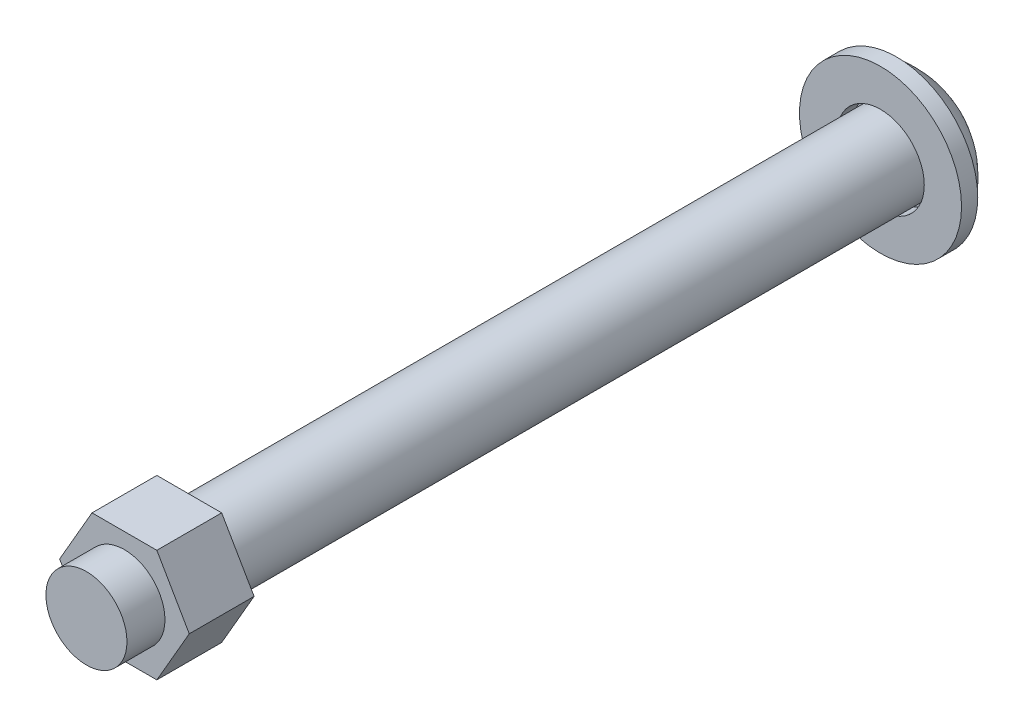
ISO-10303-21;
HEADER;
FILE_DESCRIPTION(('STEP AP214'),'2;1');
FILE_NAME('part.step','',(''),(''),'','','');
FILE_SCHEMA(('AUTOMOTIVE_DESIGN { 1 0 10303 214 1 1 1 1 }'));
ENDSEC;
DATA;
#1=APPLICATION_CONTEXT('core data for automotive mechanical design processes');
#2=APPLICATION_PROTOCOL_DEFINITION('international standard','automotive_design',2000,#1);
#3=PRODUCT_CONTEXT('',#1,'mechanical');
#4=PRODUCT('Part','Part','',(#3));
#5=PRODUCT_RELATED_PRODUCT_CATEGORY('part','',(#4));
#6=PRODUCT_DEFINITION_FORMATION('','',#4);
#7=PRODUCT_DEFINITION_CONTEXT('part definition',#1,'design');
#8=PRODUCT_DEFINITION('design','',#6,#7);
#9=PRODUCT_DEFINITION_SHAPE('','',#8);
#10=(LENGTH_UNIT() NAMED_UNIT(*) SI_UNIT(.MILLI.,.METRE.));
#11=(NAMED_UNIT(*) PLANE_ANGLE_UNIT() SI_UNIT($,.RADIAN.));
#12=(NAMED_UNIT(*) SI_UNIT($,.STERADIAN.) SOLID_ANGLE_UNIT());
#13=UNCERTAINTY_MEASURE_WITH_UNIT(LENGTH_MEASURE(1.E-05),#10,'distance_accuracy_value','');
#14=(GEOMETRIC_REPRESENTATION_CONTEXT(3) GLOBAL_UNCERTAINTY_ASSIGNED_CONTEXT((#13)) GLOBAL_UNIT_ASSIGNED_CONTEXT((#10,
#11,#12)) REPRESENTATION_CONTEXT('',''));
#15=CARTESIAN_POINT('',(0.,0.,0.));
#16=DIRECTION('',(0.,0.,1.));
#17=DIRECTION('',(1.,0.,0.));
#18=AXIS2_PLACEMENT_3D('',#15,#16,#17);
#19=CARTESIAN_POINT('',(-52.,50.6,76.75));
#20=DIRECTION('',(0.,0.,1.));
#21=DIRECTION('',(1.,0.,0.));
#22=AXIS2_PLACEMENT_3D('',#19,#20,#21);
#23=PLANE('',#22);
#24=CARTESIAN_POINT('',(-52.,50.6,76.75));
#25=DIRECTION('',(0.,0.,1.));
#26=DIRECTION('',(1.,0.,0.));
#27=AXIS2_PLACEMENT_3D('',#24,#25,#26);
#28=CIRCLE('',#27,2.5);
#29=CARTESIAN_POINT('',(-49.5,50.6,76.75));
#30=VERTEX_POINT('',#29);
#31=EDGE_CURVE('E9',#30,#30,#28,.T.);
#32=ORIENTED_EDGE('',*,*,#31,.T.);
#33=EDGE_LOOP('',(#32));
#34=FACE_BOUND('',#33,.T.);
#35=ADVANCED_FACE('F14',(#34),#23,.T.);
#36=CARTESIAN_POINT('',(-52.,50.6,26.75));
#37=DIRECTION('',(0.,0.,1.));
#38=DIRECTION('',(1.,0.,0.));
#39=AXIS2_PLACEMENT_3D('',#36,#37,#38);
#40=CYLINDRICAL_SURFACE('',#39,2.5);
#41=DIRECTION('',(0.,0.,1.));
#42=VECTOR('',#41,1.);
#43=CARTESIAN_POINT('',(-49.5,50.6,26.75));
#44=LINE('',#43,#42);
#45=CARTESIAN_POINT('',(-49.5,50.6,74.405110294118));
#46=VERTEX_POINT('',#45);
#47=EDGE_CURVE('E25',#46,#30,#44,.T.);
#48=ORIENTED_EDGE('',*,*,#47,.T.);
#49=ORIENTED_EDGE('',*,*,#31,.F.);
#50=ORIENTED_EDGE('',*,*,#47,.F.);
#51=CARTESIAN_POINT('',(-52.,50.6,74.405110294118));
#52=DIRECTION('',(0.,0.,1.));
#53=DIRECTION('',(1.,0.,0.));
#54=AXIS2_PLACEMENT_3D('',#51,#52,#53);
#55=CIRCLE('',#54,2.5);
#56=EDGE_CURVE('E138',#46,#46,#55,.T.);
#57=ORIENTED_EDGE('',*,*,#56,.T.);
#58=EDGE_LOOP('',(#48,#49,#50,#57));
#59=FACE_BOUND('',#58,.T.);
#60=ADVANCED_FACE('F269',(#59),#40,.T.);
#61=CARTESIAN_POINT('',(-52.,50.6,74.405110294118));
#62=DIRECTION('',(0.,0.,1.));
#63=DIRECTION('',(1.,0.,0.));
#64=AXIS2_PLACEMENT_3D('',#61,#62,#63);
#65=PLANE('',#64);
#66=ORIENTED_EDGE('',*,*,#56,.F.);
#67=EDGE_LOOP('',(#66));
#68=FACE_BOUND('',#67,.T.);
#69=DIRECTION('',(-0.50000000000019,0.866025403784329,0.));
#70=VECTOR('',#69,1.);
#71=CARTESIAN_POINT('',(-48.,50.6,74.405110294118));
#72=LINE('',#71,#70);
#73=CARTESIAN_POINT('',(-48.,50.6,74.405110294118));
#74=VERTEX_POINT('',#73);
#75=CARTESIAN_POINT('',(-50.,54.064101615138,74.405110294118));
#76=VERTEX_POINT('',#75);
#77=EDGE_CURVE('E205',#74,#76,#72,.T.);
#78=ORIENTED_EDGE('',*,*,#77,.T.);
#79=DIRECTION('',(-1.,0.,0.));
#80=VECTOR('',#79,1.);
#81=CARTESIAN_POINT('',(-50.,54.064101615138,74.405110294118));
#82=LINE('',#81,#80);
#83=CARTESIAN_POINT('',(-54.,54.064101615138,74.405110294118));
#84=VERTEX_POINT('',#83);
#85=EDGE_CURVE('E144',#76,#84,#82,.T.);
#86=ORIENTED_EDGE('',*,*,#85,.T.);
#87=DIRECTION('',(-0.50000000000019,-0.866025403784329,0.));
#88=VECTOR('',#87,1.);
#89=CARTESIAN_POINT('',(-54.,54.064101615138,74.405110294118));
#90=LINE('',#89,#88);
#91=CARTESIAN_POINT('',(-56.,50.6,74.405110294118));
#92=VERTEX_POINT('',#91);
#93=EDGE_CURVE('E139',#84,#92,#90,.T.);
#94=ORIENTED_EDGE('',*,*,#93,.T.);
#95=DIRECTION('',(0.50000000000019,-0.866025403784329,0.));
#96=VECTOR('',#95,1.);
#97=CARTESIAN_POINT('',(-56.,50.6,74.405110294118));
#98=LINE('',#97,#96);
#99=CARTESIAN_POINT('',(-54.,47.135898384862,74.405110294118));
#100=VERTEX_POINT('',#99);
#101=EDGE_CURVE('E127',#92,#100,#98,.T.);
#102=ORIENTED_EDGE('',*,*,#101,.T.);
#103=DIRECTION('',(1.,0.,0.));
#104=VECTOR('',#103,1.);
#105=CARTESIAN_POINT('',(-54.,47.135898384862,74.405110294118));
#106=LINE('',#105,#104);
#107=CARTESIAN_POINT('',(-50.,47.135898384862,74.405110294118));
#108=VERTEX_POINT('',#107);
#109=EDGE_CURVE('E157',#100,#108,#106,.T.);
#110=ORIENTED_EDGE('',*,*,#109,.T.);
#111=DIRECTION('',(0.50000000000019,0.866025403784329,0.));
#112=VECTOR('',#111,1.);
#113=CARTESIAN_POINT('',(-50.,47.135898384862,74.405110294118));
#114=LINE('',#113,#112);
#115=EDGE_CURVE('E178',#108,#74,#114,.T.);
#116=ORIENTED_EDGE('',*,*,#115,.T.);
#117=EDGE_LOOP('',(#78,#86,#94,#102,#110,#116));
#118=FACE_BOUND('',#117,.T.);
#119=ADVANCED_FACE('F143',(#68,#118),#65,.T.);
#120=CARTESIAN_POINT('',(-56.,50.6,70.405110294118));
#121=DIRECTION('',(0.866025403784329,0.50000000000019,0.));
#122=DIRECTION('',(0.,0.,-1.));
#123=AXIS2_PLACEMENT_3D('',#120,#121,#122);
#124=PLANE('',#123);
#125=DIRECTION('',(0.50000000000019,-0.866025403784329,0.));
#126=VECTOR('',#125,1.);
#127=CARTESIAN_POINT('',(-56.,50.6,70.405110294118));
#128=LINE('',#127,#126);
#129=CARTESIAN_POINT('',(-56.,50.6,70.405110294118));
#130=VERTEX_POINT('',#129);
#131=CARTESIAN_POINT('',(-54.,47.135898384862,70.405110294118));
#132=VERTEX_POINT('',#131);
#133=EDGE_CURVE('E229',#130,#132,#128,.T.);
#134=ORIENTED_EDGE('',*,*,#133,.T.);
#135=DIRECTION('',(0.,0.,1.));
#136=VECTOR('',#135,1.);
#137=CARTESIAN_POINT('',(-54.,47.135898384862,70.405110294118));
#138=LINE('',#137,#136);
#139=EDGE_CURVE('E133',#132,#100,#138,.T.);
#140=ORIENTED_EDGE('',*,*,#139,.T.);
#141=ORIENTED_EDGE('',*,*,#101,.F.);
#142=DIRECTION('',(0.,0.,1.));
#143=VECTOR('',#142,1.);
#144=CARTESIAN_POINT('',(-56.,50.6,70.405110294118));
#145=LINE('',#144,#143);
#146=EDGE_CURVE('E132',#130,#92,#145,.T.);
#147=ORIENTED_EDGE('',*,*,#146,.F.);
#148=EDGE_LOOP('',(#134,#140,#141,#147));
#149=FACE_BOUND('',#148,.T.);
#150=ADVANCED_FACE('F130',(#149),#124,.F.);
#151=CARTESIAN_POINT('',(-54.,54.064101615138,70.405110294118));
#152=DIRECTION('',(0.866025403784329,-0.50000000000019,0.));
#153=DIRECTION('',(0.,0.,-1.));
#154=AXIS2_PLACEMENT_3D('',#151,#152,#153);
#155=PLANE('',#154);
#156=DIRECTION('',(-0.50000000000019,-0.866025403784329,0.));
#157=VECTOR('',#156,1.);
#158=CARTESIAN_POINT('',(-54.,54.064101615138,70.405110294118));
#159=LINE('',#158,#157);
#160=CARTESIAN_POINT('',(-54.,54.064101615138,70.405110294118));
#161=VERTEX_POINT('',#160);
#162=EDGE_CURVE('E149',#161,#130,#159,.T.);
#163=ORIENTED_EDGE('',*,*,#162,.T.);
#164=ORIENTED_EDGE('',*,*,#146,.T.);
#165=ORIENTED_EDGE('',*,*,#93,.F.);
#166=DIRECTION('',(0.,0.,1.));
#167=VECTOR('',#166,1.);
#168=CARTESIAN_POINT('',(-54.,54.064101615138,70.405110294118));
#169=LINE('',#168,#167);
#170=EDGE_CURVE('E110',#161,#84,#169,.T.);
#171=ORIENTED_EDGE('',*,*,#170,.F.);
#172=EDGE_LOOP('',(#163,#164,#165,#171));
#173=FACE_BOUND('',#172,.T.);
#174=ADVANCED_FACE('F147',(#173),#155,.F.);
#175=CARTESIAN_POINT('',(-54.,47.135898384862,70.405110294118));
#176=DIRECTION('',(0.,1.,0.));
#177=DIRECTION('',(1.,0.,0.));
#178=AXIS2_PLACEMENT_3D('',#175,#176,#177);
#179=PLANE('',#178);
#180=DIRECTION('',(1.,0.,0.));
#181=VECTOR('',#180,1.);
#182=CARTESIAN_POINT('',(-54.,47.135898384862,70.405110294118));
#183=LINE('',#182,#181);
#184=CARTESIAN_POINT('',(-50.,47.135898384862,70.405110294118));
#185=VERTEX_POINT('',#184);
#186=EDGE_CURVE('E222',#132,#185,#183,.T.);
#187=ORIENTED_EDGE('',*,*,#186,.T.);
#188=DIRECTION('',(0.,0.,1.));
#189=VECTOR('',#188,1.);
#190=CARTESIAN_POINT('',(-50.,47.135898384862,70.405110294118));
#191=LINE('',#190,#189);
#192=EDGE_CURVE('E164',#185,#108,#191,.T.);
#193=ORIENTED_EDGE('',*,*,#192,.T.);
#194=ORIENTED_EDGE('',*,*,#109,.F.);
#195=ORIENTED_EDGE('',*,*,#139,.F.);
#196=EDGE_LOOP('',(#187,#193,#194,#195));
#197=FACE_BOUND('',#196,.T.);
#198=ADVANCED_FACE('F257',(#197),#179,.F.);
#199=CARTESIAN_POINT('',(-50.,54.064101615138,70.405110294118));
#200=DIRECTION('',(0.,-1.,0.));
#201=DIRECTION('',(-1.,0.,0.));
#202=AXIS2_PLACEMENT_3D('',#199,#200,#201);
#203=PLANE('',#202);
#204=DIRECTION('',(-1.,0.,0.));
#205=VECTOR('',#204,1.);
#206=CARTESIAN_POINT('',(-50.,54.064101615138,70.405110294118));
#207=LINE('',#206,#205);
#208=CARTESIAN_POINT('',(-50.,54.064101615138,70.405110294118));
#209=VERTEX_POINT('',#208);
#210=EDGE_CURVE('E212',#209,#161,#207,.T.);
#211=ORIENTED_EDGE('',*,*,#210,.T.);
#212=ORIENTED_EDGE('',*,*,#170,.T.);
#213=ORIENTED_EDGE('',*,*,#85,.F.);
#214=DIRECTION('',(0.,0.,1.));
#215=VECTOR('',#214,1.);
#216=CARTESIAN_POINT('',(-50.,54.064101615138,70.405110294118));
#217=LINE('',#216,#215);
#218=EDGE_CURVE('E120',#209,#76,#217,.T.);
#219=ORIENTED_EDGE('',*,*,#218,.F.);
#220=EDGE_LOOP('',(#211,#212,#213,#219));
#221=FACE_BOUND('',#220,.T.);
#222=ADVANCED_FACE('F255',(#221),#203,.F.);
#223=CARTESIAN_POINT('',(-50.,47.135898384862,70.405110294118));
#224=DIRECTION('',(-0.866025403784329,0.50000000000019,0.));
#225=DIRECTION('',(0.,0.,1.));
#226=AXIS2_PLACEMENT_3D('',#223,#224,#225);
#227=PLANE('',#226);
#228=DIRECTION('',(0.50000000000019,0.866025403784329,0.));
#229=VECTOR('',#228,1.);
#230=CARTESIAN_POINT('',(-50.,47.135898384862,70.405110294118));
#231=LINE('',#230,#229);
#232=CARTESIAN_POINT('',(-48.,50.6,70.405110294118));
#233=VERTEX_POINT('',#232);
#234=EDGE_CURVE('E200',#185,#233,#231,.T.);
#235=ORIENTED_EDGE('',*,*,#234,.T.);
#236=DIRECTION('',(0.,0.,1.));
#237=VECTOR('',#236,1.);
#238=CARTESIAN_POINT('',(-48.,50.6,70.405110294118));
#239=LINE('',#238,#237);
#240=EDGE_CURVE('E211',#233,#74,#239,.T.);
#241=ORIENTED_EDGE('',*,*,#240,.T.);
#242=ORIENTED_EDGE('',*,*,#115,.F.);
#243=ORIENTED_EDGE('',*,*,#192,.F.);
#244=EDGE_LOOP('',(#235,#241,#242,#243));
#245=FACE_BOUND('',#244,.T.);
#246=ADVANCED_FACE('F247',(#245),#227,.F.);
#247=CARTESIAN_POINT('',(-48.,50.6,70.405110294118));
#248=DIRECTION('',(-0.866025403784329,-0.50000000000019,0.));
#249=DIRECTION('',(-0.50000000000019,0.866025403784329,0.));
#250=AXIS2_PLACEMENT_3D('',#247,#248,#249);
#251=PLANE('',#250);
#252=DIRECTION('',(-0.50000000000019,0.866025403784329,0.));
#253=VECTOR('',#252,1.);
#254=CARTESIAN_POINT('',(-48.,50.6,70.405110294118));
#255=LINE('',#254,#253);
#256=EDGE_CURVE('E18',#233,#209,#255,.T.);
#257=ORIENTED_EDGE('',*,*,#256,.T.);
#258=ORIENTED_EDGE('',*,*,#218,.T.);
#259=ORIENTED_EDGE('',*,*,#77,.F.);
#260=ORIENTED_EDGE('',*,*,#240,.F.);
#261=EDGE_LOOP('',(#257,#258,#259,#260));
#262=FACE_BOUND('',#261,.T.);
#263=ADVANCED_FACE('F251',(#262),#251,.F.);
#264=CARTESIAN_POINT('',(-52.,50.6,70.405110294118));
#265=DIRECTION('',(0.,0.,1.));
#266=DIRECTION('',(1.,0.,0.));
#267=AXIS2_PLACEMENT_3D('',#264,#265,#266);
#268=PLANE('',#267);
#269=CARTESIAN_POINT('',(-52.,50.6,70.405110294118));
#270=DIRECTION('',(0.,0.,1.));
#271=DIRECTION('',(1.,0.,0.));
#272=AXIS2_PLACEMENT_3D('',#269,#270,#271);
#273=CIRCLE('',#272,2.5);
#274=CARTESIAN_POINT('',(-49.5,50.6,70.405110294118));
#275=VERTEX_POINT('',#274);
#276=EDGE_CURVE('E192',#275,#275,#273,.T.);
#277=ORIENTED_EDGE('',*,*,#276,.T.);
#278=EDGE_LOOP('',(#277));
#279=FACE_BOUND('',#278,.T.);
#280=ORIENTED_EDGE('',*,*,#234,.F.);
#281=ORIENTED_EDGE('',*,*,#186,.F.);
#282=ORIENTED_EDGE('',*,*,#133,.F.);
#283=ORIENTED_EDGE('',*,*,#162,.F.);
#284=ORIENTED_EDGE('',*,*,#210,.F.);
#285=ORIENTED_EDGE('',*,*,#256,.F.);
#286=EDGE_LOOP('',(#280,#281,#282,#283,#284,#285));
#287=FACE_BOUND('',#286,.T.);
#288=ADVANCED_FACE('F254',(#279,#287),#268,.F.);
#289=CARTESIAN_POINT('',(-52.,50.6,26.75));
#290=DIRECTION('',(0.,0.,1.));
#291=DIRECTION('',(1.,0.,0.));
#292=AXIS2_PLACEMENT_3D('',#289,#290,#291);
#293=CYLINDRICAL_SURFACE('',#292,2.5);
#294=ORIENTED_EDGE('',*,*,#276,.F.);
#295=DIRECTION('',(0.,0.,1.));
#296=VECTOR('',#295,1.);
#297=CARTESIAN_POINT('',(-49.5,50.6,26.75));
#298=LINE('',#297,#296);
#299=CARTESIAN_POINT('',(-49.5,50.6,26.75));
#300=VERTEX_POINT('',#299);
#301=EDGE_CURVE('E197',#300,#275,#298,.T.);
#302=ORIENTED_EDGE('',*,*,#301,.F.);
#303=CARTESIAN_POINT('',(-52.,50.6,26.75));
#304=DIRECTION('',(0.,0.,1.));
#305=DIRECTION('',(1.,0.,0.));
#306=AXIS2_PLACEMENT_3D('',#303,#304,#305);
#307=CIRCLE('',#306,2.5);
#308=EDGE_CURVE('E188',#300,#300,#307,.T.);
#309=ORIENTED_EDGE('',*,*,#308,.T.);
#310=ORIENTED_EDGE('',*,*,#301,.T.);
#311=EDGE_LOOP('',(#294,#302,#309,#310));
#312=FACE_BOUND('',#311,.T.);
#313=ADVANCED_FACE('F296',(#312),#293,.T.);
#314=CARTESIAN_POINT('',(-52.,50.6,26.75));
#315=DIRECTION('',(0.,0.,1.));
#316=DIRECTION('',(1.,0.,0.));
#317=AXIS2_PLACEMENT_3D('',#314,#315,#316);
#318=PLANE('',#317);
#319=ORIENTED_EDGE('',*,*,#308,.F.);
#320=EDGE_LOOP('',(#319));
#321=FACE_BOUND('',#320,.T.);
#322=CARTESIAN_POINT('',(-52.,50.6,26.75));
#323=DIRECTION('',(0.,0.,1.));
#324=DIRECTION('',(1.,0.,0.));
#325=AXIS2_PLACEMENT_3D('',#322,#323,#324);
#326=CIRCLE('',#325,2.7);
#327=CARTESIAN_POINT('',(-49.3,50.6,26.75));
#328=VERTEX_POINT('',#327);
#329=EDGE_CURVE('E161',#328,#328,#326,.T.);
#330=ORIENTED_EDGE('',*,*,#329,.T.);
#331=EDGE_LOOP('',(#330));
#332=FACE_BOUND('',#331,.T.);
#333=ADVANCED_FACE('F278',(#321,#332),#318,.T.);
#334=CARTESIAN_POINT('',(-52.,50.6,26.25));
#335=DIRECTION('',(0.,0.,1.));
#336=DIRECTION('',(1.,0.,0.));
#337=AXIS2_PLACEMENT_3D('',#334,#335,#336);
#338=CYLINDRICAL_SURFACE('',#337,2.7);
#339=DIRECTION('',(0.,0.,1.));
#340=VECTOR('',#339,1.);
#341=CARTESIAN_POINT('',(-49.3,50.6,26.25));
#342=LINE('',#341,#340);
#343=CARTESIAN_POINT('',(-49.3,50.6,27.75));
#344=VERTEX_POINT('',#343);
#345=EDGE_CURVE('E183',#328,#344,#342,.T.);
#346=ORIENTED_EDGE('',*,*,#345,.F.);
#347=ORIENTED_EDGE('',*,*,#329,.F.);
#348=ORIENTED_EDGE('',*,*,#345,.T.);
#349=CARTESIAN_POINT('',(-52.,50.6,27.75));
#350=DIRECTION('',(0.,0.,1.));
#351=DIRECTION('',(1.,0.,0.));
#352=AXIS2_PLACEMENT_3D('',#349,#350,#351);
#353=CIRCLE('',#352,2.7);
#354=EDGE_CURVE('E179',#344,#344,#353,.T.);
#355=ORIENTED_EDGE('',*,*,#354,.T.);
#356=EDGE_LOOP('',(#346,#347,#348,#355));
#357=FACE_BOUND('',#356,.T.);
#358=ADVANCED_FACE('F283',(#357),#338,.F.);
#359=CARTESIAN_POINT('',(-52.,50.6,27.75));
#360=DIRECTION('',(0.,0.,1.));
#361=DIRECTION('',(1.,0.,0.));
#362=AXIS2_PLACEMENT_3D('',#359,#360,#361);
#363=PLANE('',#362);
#364=ORIENTED_EDGE('',*,*,#354,.F.);
#365=EDGE_LOOP('',(#364));
#366=FACE_BOUND('',#365,.T.);
#367=CARTESIAN_POINT('',(-52.,50.6,27.75));
#368=DIRECTION('',(0.,0.,1.));
#369=DIRECTION('',(1.,0.,0.));
#370=AXIS2_PLACEMENT_3D('',#367,#368,#369);
#371=CIRCLE('',#370,5.);
#372=CARTESIAN_POINT('',(-47.,50.6,27.75));
#373=VERTEX_POINT('',#372);
#374=EDGE_CURVE('E193',#373,#373,#371,.T.);
#375=ORIENTED_EDGE('',*,*,#374,.T.);
#376=EDGE_LOOP('',(#375));
#377=FACE_BOUND('',#376,.T.);
#378=ADVANCED_FACE('F279',(#366,#377),#363,.T.);
#379=CARTESIAN_POINT('',(-52.,50.6,26.75));
#380=DIRECTION('',(0.,0.,1.));
#381=DIRECTION('',(1.,0.,0.));
#382=AXIS2_PLACEMENT_3D('',#379,#380,#381);
#383=CYLINDRICAL_SURFACE('',#382,5.);
#384=ORIENTED_EDGE('',*,*,#374,.F.);
#385=DIRECTION('',(0.,0.,1.));
#386=VECTOR('',#385,1.);
#387=CARTESIAN_POINT('',(-47.,50.6,26.75));
#388=LINE('',#387,#386);
#389=CARTESIAN_POINT('',(-47.,50.6,26.75));
#390=VERTEX_POINT('',#389);
#391=EDGE_CURVE('E184',#390,#373,#388,.T.);
#392=ORIENTED_EDGE('',*,*,#391,.F.);
#393=CARTESIAN_POINT('',(-52.,50.6,26.75));
#394=DIRECTION('',(0.,0.,1.));
#395=DIRECTION('',(1.,0.,0.));
#396=AXIS2_PLACEMENT_3D('',#393,#394,#395);
#397=CIRCLE('',#396,5.);
#398=EDGE_CURVE('E173',#390,#390,#397,.T.);
#399=ORIENTED_EDGE('',*,*,#398,.T.);
#400=ORIENTED_EDGE('',*,*,#391,.T.);
#401=EDGE_LOOP('',(#384,#392,#399,#400));
#402=FACE_BOUND('',#401,.T.);
#403=ADVANCED_FACE('F282',(#402),#383,.T.);
#404=CARTESIAN_POINT('',(-52.,50.6,26.75));
#405=DIRECTION('',(0.,0.,1.));
#406=DIRECTION('',(1.,0.,0.));
#407=AXIS2_PLACEMENT_3D('',#404,#405,#406);
#408=PLANE('',#407);
#409=CARTESIAN_POINT('',(-52.,50.6,26.75));
#410=DIRECTION('',(0.,0.,1.));
#411=DIRECTION('',(1.,0.,0.));
#412=AXIS2_PLACEMENT_3D('',#409,#410,#411);
#413=CIRCLE('',#412,4.75);
#414=CARTESIAN_POINT('',(-47.25,50.6,26.75));
#415=VERTEX_POINT('',#414);
#416=EDGE_CURVE('E174',#415,#415,#413,.T.);
#417=ORIENTED_EDGE('',*,*,#416,.T.);
#418=EDGE_LOOP('',(#417));
#419=FACE_BOUND('',#418,.T.);
#420=ORIENTED_EDGE('',*,*,#398,.F.);
#421=EDGE_LOOP('',(#420));
#422=FACE_BOUND('',#421,.T.);
#423=ADVANCED_FACE('F285',(#419,#422),#408,.F.);
#424=CARTESIAN_POINT('',(-52.,50.6,29.477272727273));
#425=DIRECTION('',(0.,0.,1.));
#426=DIRECTION('',(1.,0.,0.));
#427=AXIS2_PLACEMENT_3D('',#424,#425,#426);
#428=SPHERICAL_SURFACE('',#427,5.477272727273);
#429=ORIENTED_EDGE('',*,*,#416,.F.);
#430=CARTESIAN_POINT('',(-52.,50.6,29.477272727273));
#431=DIRECTION('',(0.,-1.,0.));
#432=DIRECTION('',(1.,0.,0.));
#433=AXIS2_PLACEMENT_3D('',#430,#431,#432);
#434=CIRCLE('',#433,5.477272727273);
#435=CARTESIAN_POINT('',(-52.,50.6,24.));
#436=VERTEX_POINT('',#435);
#437=EDGE_CURVE('E170',#436,#415,#434,.T.);
#438=ORIENTED_EDGE('',*,*,#437,.F.);
#439=ORIENTED_EDGE('',*,*,#437,.T.);
#440=EDGE_LOOP('',(#429,#438,#439));
#441=FACE_BOUND('',#440,.T.);
#442=ADVANCED_FACE('F16',(#441),#428,.T.);
#443=CLOSED_SHELL('',(#35,#60,#119,#150,#174,#198,#222,#246,#263,#288,#313,#333,#358,#378,#403,
#423,#442));
#444=MANIFOLD_SOLID_BREP('B1',#443);
#445=ADVANCED_BREP_SHAPE_REPRESENTATION('',(#18,#444),#14);
#446=SHAPE_DEFINITION_REPRESENTATION(#9,#445);
ENDSEC;
END-ISO-10303-21;
